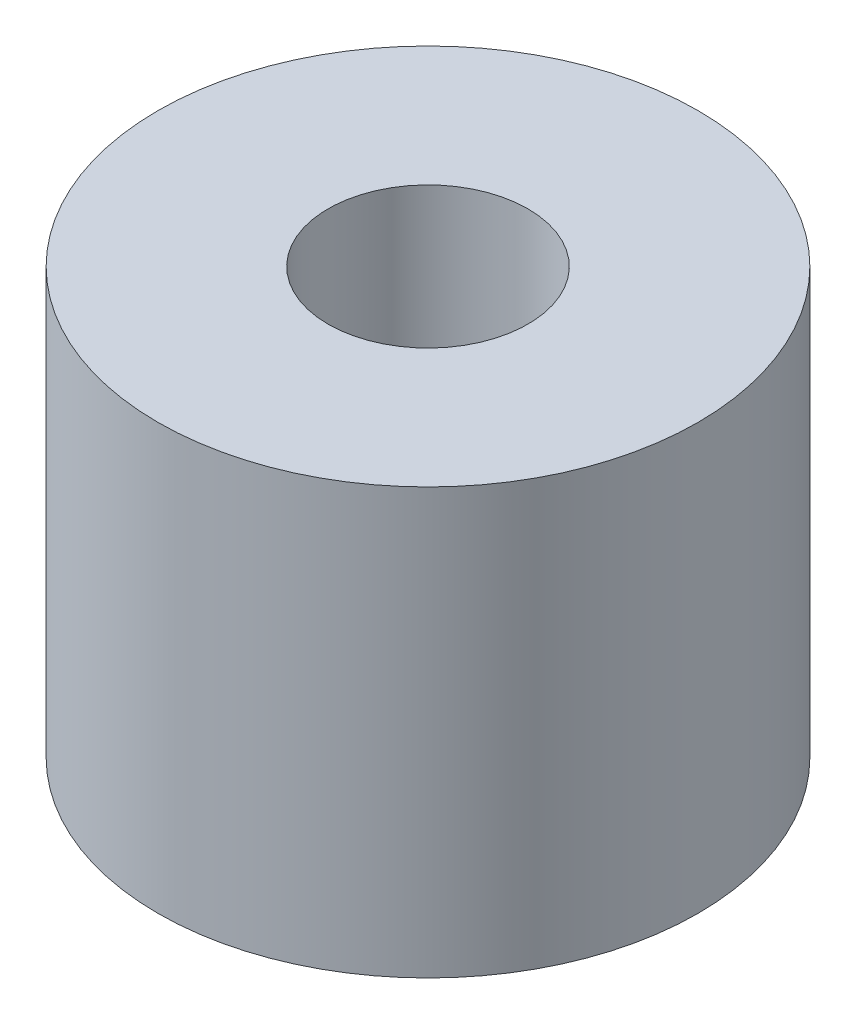
ISO-10303-21;
HEADER;
FILE_DESCRIPTION(('STEP AP214'),'2;1');
FILE_NAME('part.step','',(''),(''),'','','');
FILE_SCHEMA(('AUTOMOTIVE_DESIGN { 1 0 10303 214 1 1 1 1 }'));
ENDSEC;
DATA;
#1=APPLICATION_CONTEXT('core data for automotive mechanical design processes');
#2=APPLICATION_PROTOCOL_DEFINITION('international standard','automotive_design',2000,#1);
#3=PRODUCT_CONTEXT('',#1,'mechanical');
#4=PRODUCT('Part','Part','',(#3));
#5=PRODUCT_RELATED_PRODUCT_CATEGORY('part','',(#4));
#6=PRODUCT_DEFINITION_FORMATION('','',#4);
#7=PRODUCT_DEFINITION_CONTEXT('part definition',#1,'design');
#8=PRODUCT_DEFINITION('design','',#6,#7);
#9=PRODUCT_DEFINITION_SHAPE('','',#8);
#10=(LENGTH_UNIT() NAMED_UNIT(*) SI_UNIT(.MILLI.,.METRE.));
#11=(NAMED_UNIT(*) PLANE_ANGLE_UNIT() SI_UNIT($,.RADIAN.));
#12=(NAMED_UNIT(*) SI_UNIT($,.STERADIAN.) SOLID_ANGLE_UNIT());
#13=UNCERTAINTY_MEASURE_WITH_UNIT(LENGTH_MEASURE(1.E-05),#10,'distance_accuracy_value','');
#14=(GEOMETRIC_REPRESENTATION_CONTEXT(3) GLOBAL_UNCERTAINTY_ASSIGNED_CONTEXT((#13)) GLOBAL_UNIT_ASSIGNED_CONTEXT((#10,
#11,#12)) REPRESENTATION_CONTEXT('',''));
#15=CARTESIAN_POINT('',(0.,0.,0.));
#16=DIRECTION('',(0.,0.,1.));
#17=DIRECTION('',(1.,0.,0.));
#18=AXIS2_PLACEMENT_3D('',#15,#16,#17);
#19=CARTESIAN_POINT('',(0.,5.,0.));
#20=DIRECTION('',(0.,1.,0.));
#21=DIRECTION('',(0.,0.,1.));
#22=AXIS2_PLACEMENT_3D('',#19,#20,#21);
#23=PLANE('',#22);
#24=CARTESIAN_POINT('',(0.,5.,0.));
#25=DIRECTION('',(0.,1.,0.));
#26=DIRECTION('',(0.,0.,1.));
#27=AXIS2_PLACEMENT_3D('',#24,#25,#26);
#28=CIRCLE('',#27,3.175);
#29=CARTESIAN_POINT('',(0.,5.,3.175));
#30=VERTEX_POINT('',#29);
#31=EDGE_CURVE('E10',#30,#30,#28,.T.);
#32=ORIENTED_EDGE('',*,*,#31,.T.);
#33=EDGE_LOOP('',(#32));
#34=FACE_BOUND('',#33,.T.);
#35=CARTESIAN_POINT('',(0.,5.,0.));
#36=DIRECTION('',(0.,1.,0.));
#37=DIRECTION('',(0.,0.,1.));
#38=AXIS2_PLACEMENT_3D('',#35,#36,#37);
#39=CIRCLE('',#38,1.175);
#40=CARTESIAN_POINT('',(0.,5.,1.175));
#41=VERTEX_POINT('',#40);
#42=EDGE_CURVE('E50',#41,#41,#39,.T.);
#43=ORIENTED_EDGE('',*,*,#42,.F.);
#44=EDGE_LOOP('',(#43));
#45=FACE_BOUND('',#44,.T.);
#46=ADVANCED_FACE('F37',(#34,#45),#23,.T.);
#47=CARTESIAN_POINT('',(0.,0.,0.));
#48=DIRECTION('',(0.,1.,0.));
#49=DIRECTION('',(0.,0.,1.));
#50=AXIS2_PLACEMENT_3D('',#47,#48,#49);
#51=PLANE('',#50);
#52=CARTESIAN_POINT('',(0.,0.,0.));
#53=DIRECTION('',(0.,1.,0.));
#54=DIRECTION('',(0.,0.,1.));
#55=AXIS2_PLACEMENT_3D('',#52,#53,#54);
#56=CIRCLE('',#55,3.175);
#57=CARTESIAN_POINT('',(0.,0.,3.175));
#58=VERTEX_POINT('',#57);
#59=EDGE_CURVE('E41',#58,#58,#56,.T.);
#60=ORIENTED_EDGE('',*,*,#59,.F.);
#61=EDGE_LOOP('',(#60));
#62=FACE_BOUND('',#61,.T.);
#63=CARTESIAN_POINT('',(0.,0.,0.));
#64=DIRECTION('',(0.,1.,0.));
#65=DIRECTION('',(0.,0.,1.));
#66=AXIS2_PLACEMENT_3D('',#63,#64,#65);
#67=CIRCLE('',#66,1.175);
#68=CARTESIAN_POINT('',(0.,0.,1.175));
#69=VERTEX_POINT('',#68);
#70=EDGE_CURVE('E52',#69,#69,#67,.T.);
#71=ORIENTED_EDGE('',*,*,#70,.T.);
#72=EDGE_LOOP('',(#71));
#73=FACE_BOUND('',#72,.T.);
#74=ADVANCED_FACE('F64',(#62,#73),#51,.F.);
#75=CARTESIAN_POINT('',(0.,5.,0.));
#76=DIRECTION('',(0.,-1.,0.));
#77=DIRECTION('',(0.,0.,-1.));
#78=AXIS2_PLACEMENT_3D('',#75,#76,#77);
#79=CYLINDRICAL_SURFACE('',#78,3.175);
#80=ORIENTED_EDGE('',*,*,#31,.F.);
#81=EDGE_LOOP('',(#80));
#82=FACE_BOUND('',#81,.T.);
#83=ORIENTED_EDGE('',*,*,#59,.T.);
#84=EDGE_LOOP('',(#83));
#85=FACE_BOUND('',#84,.T.);
#86=ADVANCED_FACE('F39',(#82,#85),#79,.T.);
#87=CARTESIAN_POINT('',(0.,5.,0.));
#88=DIRECTION('',(0.,-1.,0.));
#89=DIRECTION('',(0.,0.,-1.));
#90=AXIS2_PLACEMENT_3D('',#87,#88,#89);
#91=CYLINDRICAL_SURFACE('',#90,1.175);
#92=ORIENTED_EDGE('',*,*,#42,.T.);
#93=EDGE_LOOP('',(#92));
#94=FACE_BOUND('',#93,.T.);
#95=ORIENTED_EDGE('',*,*,#70,.F.);
#96=EDGE_LOOP('',(#95));
#97=FACE_BOUND('',#96,.T.);
#98=ADVANCED_FACE('F60',(#94,#97),#91,.F.);
#99=CLOSED_SHELL('',(#46,#74,#86,#98));
#100=MANIFOLD_SOLID_BREP('B2',#99);
#101=ADVANCED_BREP_SHAPE_REPRESENTATION('',(#18,#100),#14);
#102=SHAPE_DEFINITION_REPRESENTATION(#9,#101);
ENDSEC;
END-ISO-10303-21;
